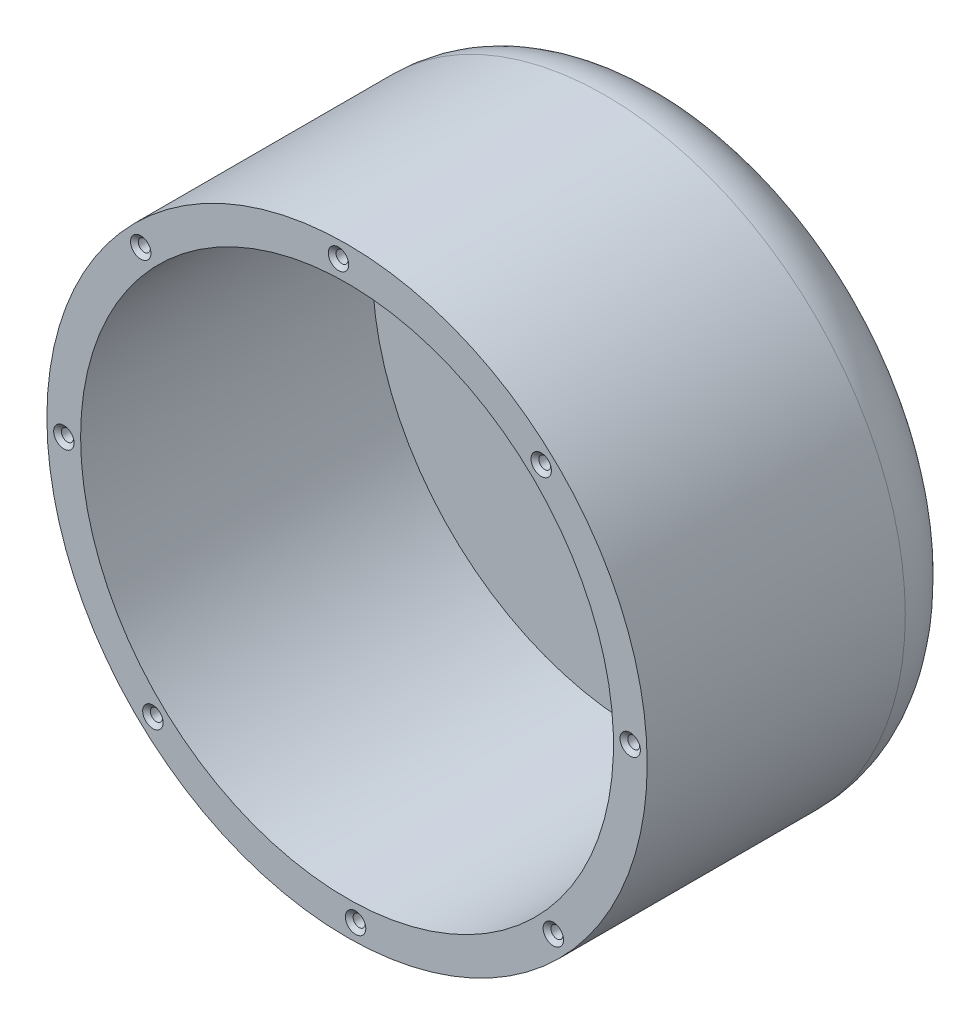
ISO-10303-21;
HEADER;
FILE_DESCRIPTION(('STEP AP214'),'2;1');
FILE_NAME('part.step','',(''),(''),'','','');
FILE_SCHEMA(('AUTOMOTIVE_DESIGN { 1 0 10303 214 1 1 1 1 }'));
ENDSEC;
DATA;
#1=APPLICATION_CONTEXT('core data for automotive mechanical design processes');
#2=APPLICATION_PROTOCOL_DEFINITION('international standard','automotive_design',2000,#1);
#3=PRODUCT_CONTEXT('',#1,'mechanical');
#4=PRODUCT('Part','Part','',(#3));
#5=PRODUCT_RELATED_PRODUCT_CATEGORY('part','',(#4));
#6=PRODUCT_DEFINITION_FORMATION('','',#4);
#7=PRODUCT_DEFINITION_CONTEXT('part definition',#1,'design');
#8=PRODUCT_DEFINITION('design','',#6,#7);
#9=PRODUCT_DEFINITION_SHAPE('','',#8);
#10=(LENGTH_UNIT() NAMED_UNIT(*) SI_UNIT(.MILLI.,.METRE.));
#11=(NAMED_UNIT(*) PLANE_ANGLE_UNIT() SI_UNIT($,.RADIAN.));
#12=(NAMED_UNIT(*) SI_UNIT($,.STERADIAN.) SOLID_ANGLE_UNIT());
#13=UNCERTAINTY_MEASURE_WITH_UNIT(LENGTH_MEASURE(1.E-05),#10,'distance_accuracy_value','');
#14=(GEOMETRIC_REPRESENTATION_CONTEXT(3) GLOBAL_UNCERTAINTY_ASSIGNED_CONTEXT((#13)) GLOBAL_UNIT_ASSIGNED_CONTEXT((#10,
#11,#12)) REPRESENTATION_CONTEXT('',''));
#15=CARTESIAN_POINT('',(0.,0.,0.));
#16=DIRECTION('',(0.,0.,1.));
#17=DIRECTION('',(1.,0.,0.));
#18=AXIS2_PLACEMENT_3D('',#15,#16,#17);
#19=CARTESIAN_POINT('',(0.,0.,24.13));
#20=DIRECTION('',(0.,0.,-1.));
#21=DIRECTION('',(-1.,0.,0.));
#22=AXIS2_PLACEMENT_3D('',#19,#20,#21);
#23=CYLINDRICAL_SURFACE('',#22,44.5);
#24=CARTESIAN_POINT('',(0.,0.,-14.13));
#25=DIRECTION('',(0.,0.,1.));
#26=DIRECTION('',(1.,0.,0.));
#27=AXIS2_PLACEMENT_3D('',#24,#25,#26);
#28=CIRCLE('',#27,44.5);
#29=CARTESIAN_POINT('',(-44.5,0.,-14.13));
#30=VERTEX_POINT('',#29);
#31=EDGE_CURVE('E54',#30,#30,#28,.T.);
#32=CARTESIAN_POINT('',(0.,0.,24.13));
#33=DIRECTION('',(0.,0.,1.));
#34=DIRECTION('',(1.,0.,0.));
#35=AXIS2_PLACEMENT_3D('',#32,#33,#34);
#36=CIRCLE('',#35,44.5);
#37=CARTESIAN_POINT('',(-44.5,0.,24.13));
#38=VERTEX_POINT('',#37);
#39=EDGE_CURVE('E190',#38,#38,#36,.T.);
#40=CARTESIAN_POINT('',(-44.5,0.,-14.13));
#41=CARTESIAN_POINT('',(-44.5,0.,-13.7314583333333));
#42=CARTESIAN_POINT('',(-44.5,0.,-13.3329166666667));
#43=CARTESIAN_POINT('',(-44.5,0.,-12.5358333333333));
#44=CARTESIAN_POINT('',(-44.5,0.,-12.1372916666667));
#45=CARTESIAN_POINT('',(-44.5,0.,-11.3402083333333));
#46=CARTESIAN_POINT('',(-44.5,0.,-10.9416666666667));
#47=CARTESIAN_POINT('',(-44.5,0.,-10.1445833333333));
#48=CARTESIAN_POINT('',(-44.5,0.,-9.74604166666668));
#49=CARTESIAN_POINT('',(-44.5,0.,-8.94895833333334));
#50=CARTESIAN_POINT('',(-44.5,0.,-8.55041666666668));
#51=CARTESIAN_POINT('',(-44.5,0.,-7.75333333333334));
#52=CARTESIAN_POINT('',(-44.5,0.,-7.35479166666668));
#53=CARTESIAN_POINT('',(-44.5,0.,-6.55770833333334));
#54=CARTESIAN_POINT('',(-44.5,0.,-6.15916666666668));
#55=CARTESIAN_POINT('',(-44.5,0.,-5.36208333333334));
#56=CARTESIAN_POINT('',(-44.5,0.,-4.96354166666668));
#57=CARTESIAN_POINT('',(-44.5,0.,-4.16645833333334));
#58=CARTESIAN_POINT('',(-44.5,0.,-3.76791666666668));
#59=CARTESIAN_POINT('',(-44.5,0.,-2.97083333333334));
#60=CARTESIAN_POINT('',(-44.5,0.,-2.57229166666668));
#61=CARTESIAN_POINT('',(-44.5,0.,-1.77520833333334));
#62=CARTESIAN_POINT('',(-44.5,0.,-1.37666666666667));
#63=CARTESIAN_POINT('',(-44.5,0.,-0.57958333333334));
#64=CARTESIAN_POINT('',(-44.5,0.,-0.181041666666674));
#65=CARTESIAN_POINT('',(-44.5,0.,0.616041666666658));
#66=CARTESIAN_POINT('',(-44.5,0.,1.01458333333332));
#67=CARTESIAN_POINT('',(-44.5,0.,1.81166666666666));
#68=CARTESIAN_POINT('',(-44.5,0.,2.21020833333333));
#69=CARTESIAN_POINT('',(-44.5,0.,3.00729166666666));
#70=CARTESIAN_POINT('',(-44.5,0.,3.40583333333333));
#71=CARTESIAN_POINT('',(-44.5,0.,4.20291666666666));
#72=CARTESIAN_POINT('',(-44.5,0.,4.60145833333333));
#73=CARTESIAN_POINT('',(-44.5,0.,5.39854166666666));
#74=CARTESIAN_POINT('',(-44.5,0.,5.79708333333333));
#75=CARTESIAN_POINT('',(-44.5,0.,6.59416666666666));
#76=CARTESIAN_POINT('',(-44.5,0.,6.99270833333333));
#77=CARTESIAN_POINT('',(-44.5,0.,7.78979166666666));
#78=CARTESIAN_POINT('',(-44.5,0.,8.18833333333333));
#79=CARTESIAN_POINT('',(-44.5,0.,8.98541666666666));
#80=CARTESIAN_POINT('',(-44.5,0.,9.38395833333333));
#81=CARTESIAN_POINT('',(-44.5,0.,10.1810416666667));
#82=CARTESIAN_POINT('',(-44.5,0.,10.5795833333333));
#83=CARTESIAN_POINT('',(-44.5,0.,11.3766666666667));
#84=CARTESIAN_POINT('',(-44.5,0.,11.7752083333333));
#85=CARTESIAN_POINT('',(-44.5,0.,12.5722916666667));
#86=CARTESIAN_POINT('',(-44.5,0.,12.9708333333333));
#87=CARTESIAN_POINT('',(-44.5,0.,13.7679166666667));
#88=CARTESIAN_POINT('',(-44.5,0.,14.1664583333333));
#89=CARTESIAN_POINT('',(-44.5,0.,14.9635416666667));
#90=CARTESIAN_POINT('',(-44.5,0.,15.3620833333333));
#91=CARTESIAN_POINT('',(-44.5,0.,16.1591666666667));
#92=CARTESIAN_POINT('',(-44.5,0.,16.5577083333333));
#93=CARTESIAN_POINT('',(-44.5,0.,17.3547916666667));
#94=CARTESIAN_POINT('',(-44.5,0.,17.7533333333333));
#95=CARTESIAN_POINT('',(-44.5,0.,18.5504166666667));
#96=CARTESIAN_POINT('',(-44.5,0.,18.9489583333333));
#97=CARTESIAN_POINT('',(-44.5,0.,19.7460416666667));
#98=CARTESIAN_POINT('',(-44.5,0.,20.1445833333333));
#99=CARTESIAN_POINT('',(-44.5,0.,20.9416666666667));
#100=CARTESIAN_POINT('',(-44.5,0.,21.3402083333333));
#101=CARTESIAN_POINT('',(-44.5,0.,22.1372916666667));
#102=CARTESIAN_POINT('',(-44.5,0.,22.5358333333333));
#103=CARTESIAN_POINT('',(-44.5,0.,23.3329166666667));
#104=CARTESIAN_POINT('',(-44.5,0.,23.7314583333333));
#105=CARTESIAN_POINT('',(-44.5,0.,24.13));
#106=B_SPLINE_CURVE_WITH_KNOTS('',3,(#40,#41,#42,#43,#44,#45,#46,#47,#48,#49,#50,#51,#52,#53,
#54,#55,#56,#57,#58,#59,#60,#61,#62,#63,#64,#65,#66,#67,#68,#69,#70,#71,#72,#73,#74,#75,#76,#77,
#78,#79,#80,#81,#82,#83,#84,#85,#86,#87,#88,#89,#90,#91,#92,#93,#94,#95,#96,#97,#98,#99,#100,
#101,#102,#103,#104,#105),.UNSPECIFIED.,.F.,.F.,(4,2,2,2,2,2,2,2,2,2,2,2,2,2,2,2,2,2,2,2,2,2,2,
2,2,2,2,2,2,2,2,2,4),(0.,1.195625,2.39125,3.586875,4.7825,5.978125,7.17375,8.369375,9.565,
10.760625,11.95625,13.151875,14.3475,15.543125,16.73875,17.934375,19.13,20.325625,21.52125,
22.716875,23.9125,25.108125,26.30375,27.499375,28.695,29.890625,31.08625,32.281875,33.4775,
34.673125,35.86875,37.064375,38.26),.UNSPECIFIED.);
#107=EDGE_CURVE('BSEAM45',#30,#38,#106,.T.);
#108=ORIENTED_EDGE('',*,*,#31,.T.);
#109=ORIENTED_EDGE('',*,*,#39,.F.);
#110=ORIENTED_EDGE('',*,*,#107,.T.);
#111=ORIENTED_EDGE('',*,*,#107,.F.);
#112=EDGE_LOOP('',(#108,#110,#109,#111));
#113=FACE_BOUND('',#112,.T.);
#114=ADVANCED_FACE('F45',(#113),#23,.T.);
#115=CARTESIAN_POINT('',(0.,0.,24.13));
#116=DIRECTION('',(0.,0.,1.));
#117=DIRECTION('',(1.,0.,0.));
#118=AXIS2_PLACEMENT_3D('',#115,#116,#117);
#119=PLANE('',#118);
#120=CARTESIAN_POINT('',(-30.5824507300641,28.7873879909797,24.13));
#121=DIRECTION('',(0.,0.,1.));
#122=DIRECTION('',(1.,0.,0.));
#123=AXIS2_PLACEMENT_3D('',#120,#121,#122);
#124=CIRCLE('',#123,1.5113);
#125=CARTESIAN_POINT('',(-29.0711507300641,28.7873879909797,24.13));
#126=VERTEX_POINT('',#125);
#127=EDGE_CURVE('E99',#126,#126,#124,.T.);
#128=ORIENTED_EDGE('',*,*,#127,.F.);
#129=EDGE_LOOP('',(#128));
#130=FACE_BOUND('',#129,.T.);
#131=CARTESIAN_POINT('',(-41.9808155576017,-1.26930103546191,24.13));
#132=DIRECTION('',(0.,0.,1.));
#133=DIRECTION('',(1.,0.,0.));
#134=AXIS2_PLACEMENT_3D('',#131,#132,#133);
#135=CIRCLE('',#134,1.5113);
#136=CARTESIAN_POINT('',(-40.4695155576017,-1.26930103546191,24.13));
#137=VERTEX_POINT('',#136);
#138=EDGE_CURVE('E90',#137,#137,#135,.T.);
#139=ORIENTED_EDGE('',*,*,#138,.F.);
#140=EDGE_LOOP('',(#139));
#141=FACE_BOUND('',#140,.T.);
#142=CARTESIAN_POINT('',(-28.7873879909796,-30.5824507300642,24.13));
#143=DIRECTION('',(0.,0.,1.));
#144=DIRECTION('',(1.,0.,0.));
#145=AXIS2_PLACEMENT_3D('',#142,#143,#144);
#146=CIRCLE('',#145,1.5113);
#147=CARTESIAN_POINT('',(-27.2760879909796,-30.5824507300642,24.13));
#148=VERTEX_POINT('',#147);
#149=EDGE_CURVE('E110',#148,#148,#146,.T.);
#150=ORIENTED_EDGE('',*,*,#149,.F.);
#151=EDGE_LOOP('',(#150));
#152=FACE_BOUND('',#151,.T.);
#153=CARTESIAN_POINT('',(1.26930103546235,-41.9808155576017,24.13));
#154=DIRECTION('',(0.,0.,1.));
#155=DIRECTION('',(1.,0.,0.));
#156=AXIS2_PLACEMENT_3D('',#153,#154,#155);
#157=CIRCLE('',#156,1.5113);
#158=CARTESIAN_POINT('',(2.78060103546235,-41.9808155576017,24.13));
#159=VERTEX_POINT('',#158);
#160=EDGE_CURVE('E122',#159,#159,#157,.T.);
#161=ORIENTED_EDGE('',*,*,#160,.F.);
#162=EDGE_LOOP('',(#161));
#163=FACE_BOUND('',#162,.T.);
#164=CARTESIAN_POINT('',(30.5824507300643,-28.7873879909795,24.13));
#165=DIRECTION('',(0.,0.,1.));
#166=DIRECTION('',(1.,0.,0.));
#167=AXIS2_PLACEMENT_3D('',#164,#165,#166);
#168=CIRCLE('',#167,1.5113);
#169=CARTESIAN_POINT('',(32.0937507300643,-28.7873879909795,24.13));
#170=VERTEX_POINT('',#169);
#171=EDGE_CURVE('E134',#170,#170,#168,.T.);
#172=ORIENTED_EDGE('',*,*,#171,.F.);
#173=EDGE_LOOP('',(#172));
#174=FACE_BOUND('',#173,.T.);
#175=CARTESIAN_POINT('',(41.9808155576017,1.2693010354622,24.13));
#176=DIRECTION('',(0.,0.,1.));
#177=DIRECTION('',(1.,0.,0.));
#178=AXIS2_PLACEMENT_3D('',#175,#176,#177);
#179=CIRCLE('',#178,1.5113);
#180=CARTESIAN_POINT('',(43.4921155576017,1.2693010354622,24.13));
#181=VERTEX_POINT('',#180);
#182=EDGE_CURVE('E146',#181,#181,#179,.T.);
#183=ORIENTED_EDGE('',*,*,#182,.F.);
#184=EDGE_LOOP('',(#183));
#185=FACE_BOUND('',#184,.T.);
#186=CARTESIAN_POINT('',(28.7873879909794,30.5824507300644,24.13));
#187=DIRECTION('',(0.,0.,1.));
#188=DIRECTION('',(1.,0.,0.));
#189=AXIS2_PLACEMENT_3D('',#186,#187,#188);
#190=CIRCLE('',#189,1.5113);
#191=CARTESIAN_POINT('',(30.2986879909794,30.5824507300644,24.13));
#192=VERTEX_POINT('',#191);
#193=EDGE_CURVE('E158',#192,#192,#190,.T.);
#194=ORIENTED_EDGE('',*,*,#193,.F.);
#195=EDGE_LOOP('',(#194));
#196=FACE_BOUND('',#195,.T.);
#197=CARTESIAN_POINT('',(-1.26930103546235,41.9808155576017,24.13));
#198=DIRECTION('',(0.,0.,1.));
#199=DIRECTION('',(1.,0.,0.));
#200=AXIS2_PLACEMENT_3D('',#197,#198,#199);
#201=CIRCLE('',#200,1.5113);
#202=CARTESIAN_POINT('',(0.241998964537651,41.9808155576017,24.13));
#203=VERTEX_POINT('',#202);
#204=EDGE_CURVE('E170',#203,#203,#201,.T.);
#205=ORIENTED_EDGE('',*,*,#204,.F.);
#206=EDGE_LOOP('',(#205));
#207=FACE_BOUND('',#206,.T.);
#208=CARTESIAN_POINT('',(0.,0.,24.13));
#209=DIRECTION('',(0.,0.,1.));
#210=DIRECTION('',(1.,0.,0.));
#211=AXIS2_PLACEMENT_3D('',#208,#209,#210);
#212=CIRCLE('',#211,39.5);
#213=CARTESIAN_POINT('',(-39.5,0.,24.13));
#214=VERTEX_POINT('',#213);
#215=EDGE_CURVE('E186',#214,#214,#212,.T.);
#216=ORIENTED_EDGE('',*,*,#215,.F.);
#217=EDGE_LOOP('',(#216));
#218=FACE_BOUND('',#217,.T.);
#219=ORIENTED_EDGE('',*,*,#39,.T.);
#220=EDGE_LOOP('',(#219));
#221=FACE_BOUND('',#220,.T.);
#222=ADVANCED_FACE('F210',(#130,#141,#152,#163,#174,#185,#196,#207,#218,#221),#119,.T.);
#223=CARTESIAN_POINT('',(0.,0.,-24.13));
#224=DIRECTION('',(0.,0.,1.));
#225=DIRECTION('',(1.,0.,0.));
#226=AXIS2_PLACEMENT_3D('',#223,#224,#225);
#227=PLANE('',#226);
#228=CARTESIAN_POINT('',(0.,0.,-24.13));
#229=DIRECTION('',(0.,0.,1.));
#230=DIRECTION('',(1.,0.,0.));
#231=AXIS2_PLACEMENT_3D('',#228,#229,#230);
#232=CIRCLE('',#231,34.5);
#233=CARTESIAN_POINT('',(34.5,0.,-24.13));
#234=VERTEX_POINT('',#233);
#235=EDGE_CURVE('E11',#234,#234,#232,.F.);
#236=ORIENTED_EDGE('',*,*,#235,.T.);
#237=EDGE_LOOP('',(#236));
#238=FACE_BOUND('',#237,.T.);
#239=ADVANCED_FACE('F214',(#238),#227,.F.);
#240=CARTESIAN_POINT('',(0.,0.,24.13));
#241=DIRECTION('',(0.,0.,-1.));
#242=DIRECTION('',(-1.,0.,0.));
#243=AXIS2_PLACEMENT_3D('',#240,#241,#242);
#244=CYLINDRICAL_SURFACE('',#243,39.5);
#245=CARTESIAN_POINT('',(0.,0.,-19.13));
#246=DIRECTION('',(0.,0.,1.));
#247=DIRECTION('',(1.,0.,0.));
#248=AXIS2_PLACEMENT_3D('',#245,#246,#247);
#249=CIRCLE('',#248,39.5);
#250=CARTESIAN_POINT('',(-39.5,0.,-19.13));
#251=VERTEX_POINT('',#250);
#252=EDGE_CURVE('E182',#251,#251,#249,.T.);
#253=CARTESIAN_POINT('',(-39.5,0.,24.13));
#254=CARTESIAN_POINT('',(-39.5,0.,23.679375));
#255=CARTESIAN_POINT('',(-39.5,0.,23.22875));
#256=CARTESIAN_POINT('',(-39.5,0.,22.3275));
#257=CARTESIAN_POINT('',(-39.5,0.,21.876875));
#258=CARTESIAN_POINT('',(-39.5,0.,20.975625));
#259=CARTESIAN_POINT('',(-39.5,0.,20.525));
#260=CARTESIAN_POINT('',(-39.5,0.,19.62375));
#261=CARTESIAN_POINT('',(-39.5,0.,19.173125));
#262=CARTESIAN_POINT('',(-39.5,0.,18.271875));
#263=CARTESIAN_POINT('',(-39.5,0.,17.82125));
#264=CARTESIAN_POINT('',(-39.5,0.,16.92));
#265=CARTESIAN_POINT('',(-39.5,0.,16.469375));
#266=CARTESIAN_POINT('',(-39.5,0.,15.568125));
#267=CARTESIAN_POINT('',(-39.5,0.,15.1175));
#268=CARTESIAN_POINT('',(-39.5,0.,14.21625));
#269=CARTESIAN_POINT('',(-39.5,0.,13.765625));
#270=CARTESIAN_POINT('',(-39.5,0.,12.864375));
#271=CARTESIAN_POINT('',(-39.5,0.,12.41375));
#272=CARTESIAN_POINT('',(-39.5,0.,11.5125));
#273=CARTESIAN_POINT('',(-39.5,0.,11.061875));
#274=CARTESIAN_POINT('',(-39.5,0.,10.160625));
#275=CARTESIAN_POINT('',(-39.5,0.,9.71));
#276=CARTESIAN_POINT('',(-39.5,0.,8.80875));
#277=CARTESIAN_POINT('',(-39.5,0.,8.358125));
#278=CARTESIAN_POINT('',(-39.5,0.,7.456875));
#279=CARTESIAN_POINT('',(-39.5,0.,7.00625));
#280=CARTESIAN_POINT('',(-39.5,0.,6.105));
#281=CARTESIAN_POINT('',(-39.5,0.,5.654375));
#282=CARTESIAN_POINT('',(-39.5,0.,4.753125));
#283=CARTESIAN_POINT('',(-39.5,0.,4.30249999999999));
#284=CARTESIAN_POINT('',(-39.5,0.,3.40124999999999));
#285=CARTESIAN_POINT('',(-39.5,0.,2.95062499999999));
#286=CARTESIAN_POINT('',(-39.5,0.,2.049375));
#287=CARTESIAN_POINT('',(-39.5,0.,1.59875));
#288=CARTESIAN_POINT('',(-39.5,0.,0.697499999999996));
#289=CARTESIAN_POINT('',(-39.5,0.,0.246874999999995));
#290=CARTESIAN_POINT('',(-39.5,0.,-0.654375000000006));
#291=CARTESIAN_POINT('',(-39.5,0.,-1.10500000000001));
#292=CARTESIAN_POINT('',(-39.5,0.,-2.00625000000001));
#293=CARTESIAN_POINT('',(-39.5,0.,-2.45687500000001));
#294=CARTESIAN_POINT('',(-39.5,0.,-3.35812500000001));
#295=CARTESIAN_POINT('',(-39.5,0.,-3.80875000000001));
#296=CARTESIAN_POINT('',(-39.5,0.,-4.71000000000001));
#297=CARTESIAN_POINT('',(-39.5,0.,-5.16062500000001));
#298=CARTESIAN_POINT('',(-39.5,0.,-6.06187500000001));
#299=CARTESIAN_POINT('',(-39.5,0.,-6.51250000000001));
#300=CARTESIAN_POINT('',(-39.5,0.,-7.41375));
#301=CARTESIAN_POINT('',(-39.5,0.,-7.864375));
#302=CARTESIAN_POINT('',(-39.5,0.,-8.765625));
#303=CARTESIAN_POINT('',(-39.5,0.,-9.21625));
#304=CARTESIAN_POINT('',(-39.5,0.,-10.1175));
#305=CARTESIAN_POINT('',(-39.5,0.,-10.568125));
#306=CARTESIAN_POINT('',(-39.5,0.,-11.469375));
#307=CARTESIAN_POINT('',(-39.5,0.,-11.92));
#308=CARTESIAN_POINT('',(-39.5,0.,-12.82125));
#309=CARTESIAN_POINT('',(-39.5,0.,-13.271875));
#310=CARTESIAN_POINT('',(-39.5,0.,-14.173125));
#311=CARTESIAN_POINT('',(-39.5,0.,-14.62375));
#312=CARTESIAN_POINT('',(-39.5,0.,-15.525));
#313=CARTESIAN_POINT('',(-39.5,0.,-15.975625));
#314=CARTESIAN_POINT('',(-39.5,0.,-16.876875));
#315=CARTESIAN_POINT('',(-39.5,0.,-17.3275));
#316=CARTESIAN_POINT('',(-39.5,0.,-18.22875));
#317=CARTESIAN_POINT('',(-39.5,0.,-18.679375));
#318=CARTESIAN_POINT('',(-39.5,0.,-19.13));
#319=B_SPLINE_CURVE_WITH_KNOTS('',3,(#253,#254,#255,#256,#257,#258,#259,#260,#261,#262,#263,
#264,#265,#266,#267,#268,#269,#270,#271,#272,#273,#274,#275,#276,#277,#278,#279,#280,#281,#282,
#283,#284,#285,#286,#287,#288,#289,#290,#291,#292,#293,#294,#295,#296,#297,#298,#299,#300,#301,
#302,#303,#304,#305,#306,#307,#308,#309,#310,#311,#312,#313,#314,#315,#316,#317,#318),
.UNSPECIFIED.,.F.,.F.,(4,2,2,2,2,2,2,2,2,2,2,2,2,2,2,2,2,2,2,2,2,2,2,2,2,2,2,2,2,2,2,2,4),(0.,
1.351875,2.70375,4.055625,5.4075,6.759375,8.11125,9.463125,10.815,12.166875,13.51875,14.870625,
16.2225,17.574375,18.92625,20.278125,21.63,22.981875,24.33375,25.685625,27.0375,28.389375,
29.74125,31.093125,32.445,33.796875,35.14875,36.500625,37.8525,39.204375,40.55625,41.908125,
43.26),.UNSPECIFIED.);
#320=EDGE_CURVE('BSEAM218',#214,#251,#319,.T.);
#321=ORIENTED_EDGE('',*,*,#215,.T.);
#322=ORIENTED_EDGE('',*,*,#252,.F.);
#323=ORIENTED_EDGE('',*,*,#320,.T.);
#324=ORIENTED_EDGE('',*,*,#320,.F.);
#325=EDGE_LOOP('',(#321,#323,#322,#324));
#326=FACE_BOUND('',#325,.T.);
#327=ADVANCED_FACE('F218',(#326),#244,.F.);
#328=CARTESIAN_POINT('',(0.,0.,-19.13));
#329=DIRECTION('',(0.,0.,1.));
#330=DIRECTION('',(1.,0.,0.));
#331=AXIS2_PLACEMENT_3D('',#328,#329,#330);
#332=PLANE('',#331);
#333=ORIENTED_EDGE('',*,*,#252,.T.);
#334=EDGE_LOOP('',(#333));
#335=FACE_BOUND('',#334,.T.);
#336=ADVANCED_FACE('F221',(#335),#332,.T.);
#337=CARTESIAN_POINT('',(-1.26930103546235,41.9808155576017,21.59));
#338=DIRECTION('',(0.,0.,1.));
#339=DIRECTION('',(1.,0.,0.));
#340=AXIS2_PLACEMENT_3D('',#337,#338,#339);
#341=CONICAL_SURFACE('',#340,0.888999999999999,1.02974425867665);
#342=CARTESIAN_POINT('',(-1.26930103546235,41.9808155576017,21.0558349096845));
#343=VERTEX_POINT('',#342);
#344=VERTEX_LOOP('',#343);
#345=FACE_BOUND('',#344,.T.);
#346=CARTESIAN_POINT('',(-1.26930103546235,41.9808155576017,21.59));
#347=DIRECTION('',(0.,0.,1.));
#348=DIRECTION('',(1.,0.,0.));
#349=AXIS2_PLACEMENT_3D('',#346,#347,#348);
#350=CIRCLE('',#349,0.888999999999999);
#351=CARTESIAN_POINT('',(-0.38030103546235,41.9808155576017,21.59));
#352=VERTEX_POINT('',#351);
#353=EDGE_CURVE('E178',#352,#352,#350,.T.);
#354=ORIENTED_EDGE('',*,*,#353,.T.);
#355=EDGE_LOOP('',(#354));
#356=FACE_BOUND('',#355,.T.);
#357=ADVANCED_FACE('F224',(#345,#356),#341,.F.);
#358=CARTESIAN_POINT('',(-1.26930103546235,41.9808155576017,24.13));
#359=DIRECTION('',(0.,0.,1.));
#360=DIRECTION('',(1.,0.,0.));
#361=AXIS2_PLACEMENT_3D('',#358,#359,#360);
#362=CYLINDRICAL_SURFACE('',#361,0.889);
#363=ORIENTED_EDGE('',*,*,#353,.F.);
#364=EDGE_LOOP('',(#363));
#365=FACE_BOUND('',#364,.T.);
#366=CARTESIAN_POINT('',(-1.26930103546235,41.9808155576017,23.6078282995184));
#367=DIRECTION('',(0.,0.,1.));
#368=DIRECTION('',(1.,0.,0.));
#369=AXIS2_PLACEMENT_3D('',#366,#367,#368);
#370=CIRCLE('',#369,0.889);
#371=CARTESIAN_POINT('',(-0.380301035462349,41.9808155576017,23.6078282995184));
#372=VERTEX_POINT('',#371);
#373=EDGE_CURVE('E174',#372,#372,#370,.T.);
#374=ORIENTED_EDGE('',*,*,#373,.T.);
#375=EDGE_LOOP('',(#374));
#376=FACE_BOUND('',#375,.T.);
#377=ADVANCED_FACE('F231',(#365,#376),#362,.F.);
#378=CARTESIAN_POINT('',(-1.26930103546235,41.9808155576017,24.13));
#379=DIRECTION('',(0.,0.,1.));
#380=DIRECTION('',(1.,0.,0.));
#381=AXIS2_PLACEMENT_3D('',#378,#379,#380);
#382=CONICAL_SURFACE('',#381,1.5113,0.872664625997164);
#383=ORIENTED_EDGE('',*,*,#373,.F.);
#384=EDGE_LOOP('',(#383));
#385=FACE_BOUND('',#384,.T.);
#386=ORIENTED_EDGE('',*,*,#204,.T.);
#387=EDGE_LOOP('',(#386));
#388=FACE_BOUND('',#387,.T.);
#389=ADVANCED_FACE('F234',(#385,#388),#382,.F.);
#390=CARTESIAN_POINT('',(28.7873879909794,30.5824507300644,21.59));
#391=DIRECTION('',(0.,0.,1.));
#392=DIRECTION('',(1.,0.,0.));
#393=AXIS2_PLACEMENT_3D('',#390,#391,#392);
#394=CONICAL_SURFACE('',#393,0.889000000000001,1.02974425867665);
#395=CARTESIAN_POINT('',(28.7873879909794,30.5824507300644,21.0558349096845));
#396=VERTEX_POINT('',#395);
#397=VERTEX_LOOP('',#396);
#398=FACE_BOUND('',#397,.T.);
#399=CARTESIAN_POINT('',(28.7873879909794,30.5824507300644,21.59));
#400=DIRECTION('',(0.,0.,1.));
#401=DIRECTION('',(1.,0.,0.));
#402=AXIS2_PLACEMENT_3D('',#399,#400,#401);
#403=CIRCLE('',#402,0.889000000000001);
#404=CARTESIAN_POINT('',(29.6763879909794,30.5824507300644,21.59));
#405=VERTEX_POINT('',#404);
#406=EDGE_CURVE('E166',#405,#405,#403,.T.);
#407=ORIENTED_EDGE('',*,*,#406,.T.);
#408=EDGE_LOOP('',(#407));
#409=FACE_BOUND('',#408,.T.);
#410=ADVANCED_FACE('F238',(#398,#409),#394,.F.);
#411=CARTESIAN_POINT('',(28.7873879909794,30.5824507300644,24.13));
#412=DIRECTION('',(0.,0.,1.));
#413=DIRECTION('',(1.,0.,0.));
#414=AXIS2_PLACEMENT_3D('',#411,#412,#413);
#415=CYLINDRICAL_SURFACE('',#414,0.889000000000001);
#416=ORIENTED_EDGE('',*,*,#406,.F.);
#417=EDGE_LOOP('',(#416));
#418=FACE_BOUND('',#417,.T.);
#419=CARTESIAN_POINT('',(28.7873879909794,30.5824507300644,23.6078282995184));
#420=DIRECTION('',(0.,0.,1.));
#421=DIRECTION('',(1.,0.,0.));
#422=AXIS2_PLACEMENT_3D('',#419,#420,#421);
#423=CIRCLE('',#422,0.889000000000001);
#424=CARTESIAN_POINT('',(29.6763879909794,30.5824507300644,23.6078282995184));
#425=VERTEX_POINT('',#424);
#426=EDGE_CURVE('E162',#425,#425,#423,.T.);
#427=ORIENTED_EDGE('',*,*,#426,.T.);
#428=EDGE_LOOP('',(#427));
#429=FACE_BOUND('',#428,.T.);
#430=ADVANCED_FACE('F242',(#418,#429),#415,.F.);
#431=CARTESIAN_POINT('',(28.7873879909794,30.5824507300644,24.13));
#432=DIRECTION('',(0.,0.,1.));
#433=DIRECTION('',(1.,0.,0.));
#434=AXIS2_PLACEMENT_3D('',#431,#432,#433);
#435=CONICAL_SURFACE('',#434,1.5113,0.872664625997163);
#436=ORIENTED_EDGE('',*,*,#426,.F.);
#437=EDGE_LOOP('',(#436));
#438=FACE_BOUND('',#437,.T.);
#439=ORIENTED_EDGE('',*,*,#193,.T.);
#440=EDGE_LOOP('',(#439));
#441=FACE_BOUND('',#440,.T.);
#442=ADVANCED_FACE('F245',(#438,#441),#435,.F.);
#443=CARTESIAN_POINT('',(41.9808155576017,1.2693010354622,21.59));
#444=DIRECTION('',(0.,0.,1.));
#445=DIRECTION('',(1.,0.,0.));
#446=AXIS2_PLACEMENT_3D('',#443,#444,#445);
#447=CONICAL_SURFACE('',#446,0.889000000000001,1.02974425867665);
#448=CARTESIAN_POINT('',(41.9808155576017,1.2693010354622,21.0558349096845));
#449=VERTEX_POINT('',#448);
#450=VERTEX_LOOP('',#449);
#451=FACE_BOUND('',#450,.T.);
#452=CARTESIAN_POINT('',(41.9808155576017,1.2693010354622,21.59));
#453=DIRECTION('',(0.,0.,1.));
#454=DIRECTION('',(1.,0.,0.));
#455=AXIS2_PLACEMENT_3D('',#452,#453,#454);
#456=CIRCLE('',#455,0.889000000000001);
#457=CARTESIAN_POINT('',(42.8698155576017,1.2693010354622,21.59));
#458=VERTEX_POINT('',#457);
#459=EDGE_CURVE('E154',#458,#458,#456,.T.);
#460=ORIENTED_EDGE('',*,*,#459,.T.);
#461=EDGE_LOOP('',(#460));
#462=FACE_BOUND('',#461,.T.);
#463=ADVANCED_FACE('F249',(#451,#462),#447,.F.);
#464=CARTESIAN_POINT('',(41.9808155576017,1.2693010354622,24.13));
#465=DIRECTION('',(0.,0.,1.));
#466=DIRECTION('',(1.,0.,0.));
#467=AXIS2_PLACEMENT_3D('',#464,#465,#466);
#468=CYLINDRICAL_SURFACE('',#467,0.889000000000001);
#469=ORIENTED_EDGE('',*,*,#459,.F.);
#470=EDGE_LOOP('',(#469));
#471=FACE_BOUND('',#470,.T.);
#472=CARTESIAN_POINT('',(41.9808155576017,1.2693010354622,23.6078282995184));
#473=DIRECTION('',(0.,0.,1.));
#474=DIRECTION('',(1.,0.,0.));
#475=AXIS2_PLACEMENT_3D('',#472,#473,#474);
#476=CIRCLE('',#475,0.889000000000001);
#477=CARTESIAN_POINT('',(42.8698155576017,1.2693010354622,23.6078282995184));
#478=VERTEX_POINT('',#477);
#479=EDGE_CURVE('E150',#478,#478,#476,.T.);
#480=ORIENTED_EDGE('',*,*,#479,.T.);
#481=EDGE_LOOP('',(#480));
#482=FACE_BOUND('',#481,.T.);
#483=ADVANCED_FACE('F253',(#471,#482),#468,.F.);
#484=CARTESIAN_POINT('',(41.9808155576017,1.2693010354622,24.13));
#485=DIRECTION('',(0.,0.,1.));
#486=DIRECTION('',(1.,0.,0.));
#487=AXIS2_PLACEMENT_3D('',#484,#485,#486);
#488=CONICAL_SURFACE('',#487,1.5113,0.872664625997163);
#489=ORIENTED_EDGE('',*,*,#479,.F.);
#490=EDGE_LOOP('',(#489));
#491=FACE_BOUND('',#490,.T.);
#492=ORIENTED_EDGE('',*,*,#182,.T.);
#493=EDGE_LOOP('',(#492));
#494=FACE_BOUND('',#493,.T.);
#495=ADVANCED_FACE('F257',(#491,#494),#488,.F.);
#496=CARTESIAN_POINT('',(30.5824507300643,-28.7873879909795,21.59));
#497=DIRECTION('',(0.,0.,1.));
#498=DIRECTION('',(1.,0.,0.));
#499=AXIS2_PLACEMENT_3D('',#496,#497,#498);
#500=CONICAL_SURFACE('',#499,0.889000000000001,1.02974425867665);
#501=CARTESIAN_POINT('',(30.5824507300643,-28.7873879909795,21.0558349096845));
#502=VERTEX_POINT('',#501);
#503=VERTEX_LOOP('',#502);
#504=FACE_BOUND('',#503,.T.);
#505=CARTESIAN_POINT('',(30.5824507300643,-28.7873879909795,21.59));
#506=DIRECTION('',(0.,0.,1.));
#507=DIRECTION('',(1.,0.,0.));
#508=AXIS2_PLACEMENT_3D('',#505,#506,#507);
#509=CIRCLE('',#508,0.889000000000001);
#510=CARTESIAN_POINT('',(31.4714507300643,-28.7873879909795,21.59));
#511=VERTEX_POINT('',#510);
#512=EDGE_CURVE('E142',#511,#511,#509,.T.);
#513=ORIENTED_EDGE('',*,*,#512,.T.);
#514=EDGE_LOOP('',(#513));
#515=FACE_BOUND('',#514,.T.);
#516=ADVANCED_FACE('F261',(#504,#515),#500,.F.);
#517=CARTESIAN_POINT('',(30.5824507300643,-28.7873879909795,24.13));
#518=DIRECTION('',(0.,0.,1.));
#519=DIRECTION('',(1.,0.,0.));
#520=AXIS2_PLACEMENT_3D('',#517,#518,#519);
#521=CYLINDRICAL_SURFACE('',#520,0.889000000000001);
#522=ORIENTED_EDGE('',*,*,#512,.F.);
#523=EDGE_LOOP('',(#522));
#524=FACE_BOUND('',#523,.T.);
#525=CARTESIAN_POINT('',(30.5824507300643,-28.7873879909795,23.6078282995184));
#526=DIRECTION('',(0.,0.,1.));
#527=DIRECTION('',(1.,0.,0.));
#528=AXIS2_PLACEMENT_3D('',#525,#526,#527);
#529=CIRCLE('',#528,0.889000000000001);
#530=CARTESIAN_POINT('',(31.4714507300643,-28.7873879909795,23.6078282995184));
#531=VERTEX_POINT('',#530);
#532=EDGE_CURVE('E138',#531,#531,#529,.T.);
#533=ORIENTED_EDGE('',*,*,#532,.T.);
#534=EDGE_LOOP('',(#533));
#535=FACE_BOUND('',#534,.T.);
#536=ADVANCED_FACE('F265',(#524,#535),#521,.F.);
#537=CARTESIAN_POINT('',(30.5824507300643,-28.7873879909795,24.13));
#538=DIRECTION('',(0.,0.,1.));
#539=DIRECTION('',(1.,0.,0.));
#540=AXIS2_PLACEMENT_3D('',#537,#538,#539);
#541=CONICAL_SURFACE('',#540,1.5113,0.872664625997163);
#542=ORIENTED_EDGE('',*,*,#532,.F.);
#543=EDGE_LOOP('',(#542));
#544=FACE_BOUND('',#543,.T.);
#545=ORIENTED_EDGE('',*,*,#171,.T.);
#546=EDGE_LOOP('',(#545));
#547=FACE_BOUND('',#546,.T.);
#548=ADVANCED_FACE('F269',(#544,#547),#541,.F.);
#549=CARTESIAN_POINT('',(1.26930103546235,-41.9808155576017,21.59));
#550=DIRECTION('',(0.,0.,1.));
#551=DIRECTION('',(1.,0.,0.));
#552=AXIS2_PLACEMENT_3D('',#549,#550,#551);
#553=CONICAL_SURFACE('',#552,0.889,1.02974425867665);
#554=CARTESIAN_POINT('',(1.26930103546235,-41.9808155576017,21.0558349096845));
#555=VERTEX_POINT('',#554);
#556=VERTEX_LOOP('',#555);
#557=FACE_BOUND('',#556,.T.);
#558=CARTESIAN_POINT('',(1.26930103546235,-41.9808155576017,21.59));
#559=DIRECTION('',(0.,0.,1.));
#560=DIRECTION('',(1.,0.,0.));
#561=AXIS2_PLACEMENT_3D('',#558,#559,#560);
#562=CIRCLE('',#561,0.889);
#563=CARTESIAN_POINT('',(2.15830103546235,-41.9808155576017,21.59));
#564=VERTEX_POINT('',#563);
#565=EDGE_CURVE('E130',#564,#564,#562,.T.);
#566=ORIENTED_EDGE('',*,*,#565,.T.);
#567=EDGE_LOOP('',(#566));
#568=FACE_BOUND('',#567,.T.);
#569=ADVANCED_FACE('F273',(#557,#568),#553,.F.);
#570=CARTESIAN_POINT('',(1.26930103546235,-41.9808155576017,24.13));
#571=DIRECTION('',(0.,0.,1.));
#572=DIRECTION('',(1.,0.,0.));
#573=AXIS2_PLACEMENT_3D('',#570,#571,#572);
#574=CYLINDRICAL_SURFACE('',#573,0.889);
#575=ORIENTED_EDGE('',*,*,#565,.F.);
#576=EDGE_LOOP('',(#575));
#577=FACE_BOUND('',#576,.T.);
#578=CARTESIAN_POINT('',(1.26930103546235,-41.9808155576017,23.6078282995184));
#579=DIRECTION('',(0.,0.,1.));
#580=DIRECTION('',(1.,0.,0.));
#581=AXIS2_PLACEMENT_3D('',#578,#579,#580);
#582=CIRCLE('',#581,0.889);
#583=CARTESIAN_POINT('',(2.15830103546235,-41.9808155576017,23.6078282995184));
#584=VERTEX_POINT('',#583);
#585=EDGE_CURVE('E126',#584,#584,#582,.T.);
#586=ORIENTED_EDGE('',*,*,#585,.T.);
#587=EDGE_LOOP('',(#586));
#588=FACE_BOUND('',#587,.T.);
#589=ADVANCED_FACE('F277',(#577,#588),#574,.F.);
#590=CARTESIAN_POINT('',(1.26930103546235,-41.9808155576017,24.13));
#591=DIRECTION('',(0.,0.,1.));
#592=DIRECTION('',(1.,0.,0.));
#593=AXIS2_PLACEMENT_3D('',#590,#591,#592);
#594=CONICAL_SURFACE('',#593,1.5113,0.872664625997164);
#595=ORIENTED_EDGE('',*,*,#585,.F.);
#596=EDGE_LOOP('',(#595));
#597=FACE_BOUND('',#596,.T.);
#598=ORIENTED_EDGE('',*,*,#160,.T.);
#599=EDGE_LOOP('',(#598));
#600=FACE_BOUND('',#599,.T.);
#601=ADVANCED_FACE('F281',(#597,#600),#594,.F.);
#602=CARTESIAN_POINT('',(-28.7873879909796,-30.5824507300642,21.59));
#603=DIRECTION('',(0.,0.,1.));
#604=DIRECTION('',(1.,0.,0.));
#605=AXIS2_PLACEMENT_3D('',#602,#603,#604);
#606=CONICAL_SURFACE('',#605,0.889000000000001,1.02974425867665);
#607=CARTESIAN_POINT('',(-28.7873879909796,-30.5824507300642,21.0558349096845));
#608=VERTEX_POINT('',#607);
#609=VERTEX_LOOP('',#608);
#610=FACE_BOUND('',#609,.T.);
#611=CARTESIAN_POINT('',(-28.7873879909796,-30.5824507300642,21.59));
#612=DIRECTION('',(0.,0.,1.));
#613=DIRECTION('',(1.,0.,0.));
#614=AXIS2_PLACEMENT_3D('',#611,#612,#613);
#615=CIRCLE('',#614,0.889000000000001);
#616=CARTESIAN_POINT('',(-27.8983879909796,-30.5824507300642,21.59));
#617=VERTEX_POINT('',#616);
#618=EDGE_CURVE('E118',#617,#617,#615,.T.);
#619=ORIENTED_EDGE('',*,*,#618,.T.);
#620=EDGE_LOOP('',(#619));
#621=FACE_BOUND('',#620,.T.);
#622=ADVANCED_FACE('F285',(#610,#621),#606,.F.);
#623=CARTESIAN_POINT('',(-28.7873879909796,-30.5824507300642,24.13));
#624=DIRECTION('',(0.,0.,1.));
#625=DIRECTION('',(1.,0.,0.));
#626=AXIS2_PLACEMENT_3D('',#623,#624,#625);
#627=CYLINDRICAL_SURFACE('',#626,0.889000000000001);
#628=ORIENTED_EDGE('',*,*,#618,.F.);
#629=EDGE_LOOP('',(#628));
#630=FACE_BOUND('',#629,.T.);
#631=CARTESIAN_POINT('',(-28.7873879909796,-30.5824507300642,23.6078282995184));
#632=DIRECTION('',(0.,0.,1.));
#633=DIRECTION('',(1.,0.,0.));
#634=AXIS2_PLACEMENT_3D('',#631,#632,#633);
#635=CIRCLE('',#634,0.889000000000001);
#636=CARTESIAN_POINT('',(-27.8983879909796,-30.5824507300642,23.6078282995184));
#637=VERTEX_POINT('',#636);
#638=EDGE_CURVE('E114',#637,#637,#635,.T.);
#639=ORIENTED_EDGE('',*,*,#638,.T.);
#640=EDGE_LOOP('',(#639));
#641=FACE_BOUND('',#640,.T.);
#642=ADVANCED_FACE('F289',(#630,#641),#627,.F.);
#643=CARTESIAN_POINT('',(-28.7873879909796,-30.5824507300642,24.13));
#644=DIRECTION('',(0.,0.,1.));
#645=DIRECTION('',(1.,0.,0.));
#646=AXIS2_PLACEMENT_3D('',#643,#644,#645);
#647=CONICAL_SURFACE('',#646,1.5113,0.872664625997163);
#648=ORIENTED_EDGE('',*,*,#638,.F.);
#649=EDGE_LOOP('',(#648));
#650=FACE_BOUND('',#649,.T.);
#651=ORIENTED_EDGE('',*,*,#149,.T.);
#652=EDGE_LOOP('',(#651));
#653=FACE_BOUND('',#652,.T.);
#654=ADVANCED_FACE('F293',(#650,#653),#647,.F.);
#655=CARTESIAN_POINT('',(-41.9808155576017,-1.26930103546191,21.59));
#656=DIRECTION('',(0.,0.,1.));
#657=DIRECTION('',(1.,0.,0.));
#658=AXIS2_PLACEMENT_3D('',#655,#656,#657);
#659=CONICAL_SURFACE('',#658,0.889000000000001,1.02974425867665);
#660=CARTESIAN_POINT('',(-41.9808155576017,-1.26930103546191,21.0558349096845));
#661=VERTEX_POINT('',#660);
#662=VERTEX_LOOP('',#661);
#663=FACE_BOUND('',#662,.T.);
#664=CARTESIAN_POINT('',(-41.9808155576017,-1.26930103546191,21.59));
#665=DIRECTION('',(0.,0.,1.));
#666=DIRECTION('',(1.,0.,0.));
#667=AXIS2_PLACEMENT_3D('',#664,#665,#666);
#668=CIRCLE('',#667,0.889000000000001);
#669=CARTESIAN_POINT('',(-41.0918155576017,-1.26930103546191,21.59));
#670=VERTEX_POINT('',#669);
#671=EDGE_CURVE('E106',#670,#670,#668,.T.);
#672=ORIENTED_EDGE('',*,*,#671,.T.);
#673=EDGE_LOOP('',(#672));
#674=FACE_BOUND('',#673,.T.);
#675=ADVANCED_FACE('F297',(#663,#674),#659,.F.);
#676=CARTESIAN_POINT('',(-41.9808155576017,-1.26930103546191,24.13));
#677=DIRECTION('',(0.,0.,1.));
#678=DIRECTION('',(1.,0.,0.));
#679=AXIS2_PLACEMENT_3D('',#676,#677,#678);
#680=CYLINDRICAL_SURFACE('',#679,0.889000000000001);
#681=ORIENTED_EDGE('',*,*,#671,.F.);
#682=EDGE_LOOP('',(#681));
#683=FACE_BOUND('',#682,.T.);
#684=CARTESIAN_POINT('',(-41.9808155576017,-1.26930103546191,23.6078282995184));
#685=DIRECTION('',(0.,0.,1.));
#686=DIRECTION('',(1.,0.,0.));
#687=AXIS2_PLACEMENT_3D('',#684,#685,#686);
#688=CIRCLE('',#687,0.889000000000001);
#689=CARTESIAN_POINT('',(-41.0918155576017,-1.26930103546191,23.6078282995184));
#690=VERTEX_POINT('',#689);
#691=EDGE_CURVE('E96',#690,#690,#688,.T.);
#692=ORIENTED_EDGE('',*,*,#691,.T.);
#693=EDGE_LOOP('',(#692));
#694=FACE_BOUND('',#693,.T.);
#695=ADVANCED_FACE('F301',(#683,#694),#680,.F.);
#696=CARTESIAN_POINT('',(-41.9808155576017,-1.26930103546191,24.13));
#697=DIRECTION('',(0.,0.,1.));
#698=DIRECTION('',(1.,0.,0.));
#699=AXIS2_PLACEMENT_3D('',#696,#697,#698);
#700=CONICAL_SURFACE('',#699,1.5113,0.872664625997163);
#701=ORIENTED_EDGE('',*,*,#691,.F.);
#702=EDGE_LOOP('',(#701));
#703=FACE_BOUND('',#702,.T.);
#704=ORIENTED_EDGE('',*,*,#138,.T.);
#705=EDGE_LOOP('',(#704));
#706=FACE_BOUND('',#705,.T.);
#707=ADVANCED_FACE('F83',(#703,#706),#700,.F.);
#708=CARTESIAN_POINT('',(-30.5824507300641,28.7873879909797,21.59));
#709=DIRECTION('',(0.,0.,1.));
#710=DIRECTION('',(1.,0.,0.));
#711=AXIS2_PLACEMENT_3D('',#708,#709,#710);
#712=CONICAL_SURFACE('',#711,0.889000000000001,1.02974425867665);
#713=CARTESIAN_POINT('',(-30.5824507300641,28.7873879909797,21.0558349096845));
#714=VERTEX_POINT('',#713);
#715=VERTEX_LOOP('',#714);
#716=FACE_BOUND('',#715,.T.);
#717=CARTESIAN_POINT('',(-30.5824507300641,28.7873879909797,21.59));
#718=DIRECTION('',(0.,0.,1.));
#719=DIRECTION('',(1.,0.,0.));
#720=AXIS2_PLACEMENT_3D('',#717,#718,#719);
#721=CIRCLE('',#720,0.889000000000001);
#722=CARTESIAN_POINT('',(-29.6934507300641,28.7873879909797,21.59));
#723=VERTEX_POINT('',#722);
#724=EDGE_CURVE('E87',#723,#723,#721,.T.);
#725=ORIENTED_EDGE('',*,*,#724,.T.);
#726=EDGE_LOOP('',(#725));
#727=FACE_BOUND('',#726,.T.);
#728=ADVANCED_FACE('F79',(#716,#727),#712,.F.);
#729=CARTESIAN_POINT('',(-30.5824507300641,28.7873879909797,24.13));
#730=DIRECTION('',(0.,0.,1.));
#731=DIRECTION('',(1.,0.,0.));
#732=AXIS2_PLACEMENT_3D('',#729,#730,#731);
#733=CYLINDRICAL_SURFACE('',#732,0.889000000000001);
#734=ORIENTED_EDGE('',*,*,#724,.F.);
#735=EDGE_LOOP('',(#734));
#736=FACE_BOUND('',#735,.T.);
#737=CARTESIAN_POINT('',(-30.5824507300641,28.7873879909797,23.6078282995184));
#738=DIRECTION('',(0.,0.,1.));
#739=DIRECTION('',(1.,0.,0.));
#740=AXIS2_PLACEMENT_3D('',#737,#738,#739);
#741=CIRCLE('',#740,0.889000000000001);
#742=CARTESIAN_POINT('',(-29.6934507300641,28.7873879909797,23.6078282995184));
#743=VERTEX_POINT('',#742);
#744=EDGE_CURVE('E91',#743,#743,#741,.T.);
#745=ORIENTED_EDGE('',*,*,#744,.T.);
#746=EDGE_LOOP('',(#745));
#747=FACE_BOUND('',#746,.T.);
#748=ADVANCED_FACE('F82',(#736,#747),#733,.F.);
#749=CARTESIAN_POINT('',(-30.5824507300641,28.7873879909797,24.13));
#750=DIRECTION('',(0.,0.,1.));
#751=DIRECTION('',(1.,0.,0.));
#752=AXIS2_PLACEMENT_3D('',#749,#750,#751);
#753=CONICAL_SURFACE('',#752,1.5113,0.872664625997163);
#754=ORIENTED_EDGE('',*,*,#744,.F.);
#755=EDGE_LOOP('',(#754));
#756=FACE_BOUND('',#755,.T.);
#757=ORIENTED_EDGE('',*,*,#127,.T.);
#758=EDGE_LOOP('',(#757));
#759=FACE_BOUND('',#758,.T.);
#760=ADVANCED_FACE('F200',(#756,#759),#753,.F.);
#761=CARTESIAN_POINT('',(0.,0.,-14.13));
#762=DIRECTION('',(0.,0.,1.));
#763=DIRECTION('',(1.,0.,0.));
#764=AXIS2_PLACEMENT_3D('',#761,#762,#763);
#765=TOROIDAL_SURFACE('',#764,34.5,10.);
#766=ORIENTED_EDGE('',*,*,#235,.F.);
#767=EDGE_LOOP('',(#766));
#768=FACE_BOUND('',#767,.T.);
#769=ORIENTED_EDGE('',*,*,#31,.F.);
#770=EDGE_LOOP('',(#769));
#771=FACE_BOUND('',#770,.T.);
#772=ADVANCED_FACE('F47',(#768,#771),#765,.T.);
#773=CLOSED_SHELL('',(#114,#222,#239,#327,#336,#357,#377,#389,#410,#430,#442,#463,#483,#495,
#516,#536,#548,#569,#589,#601,#622,#642,#654,#675,#695,#707,#728,#748,#760,#772));
#774=MANIFOLD_SOLID_BREP('B2',#773);
#775=ADVANCED_BREP_SHAPE_REPRESENTATION('',(#18,#774),#14);
#776=SHAPE_DEFINITION_REPRESENTATION(#9,#775);
ENDSEC;
END-ISO-10303-21;
